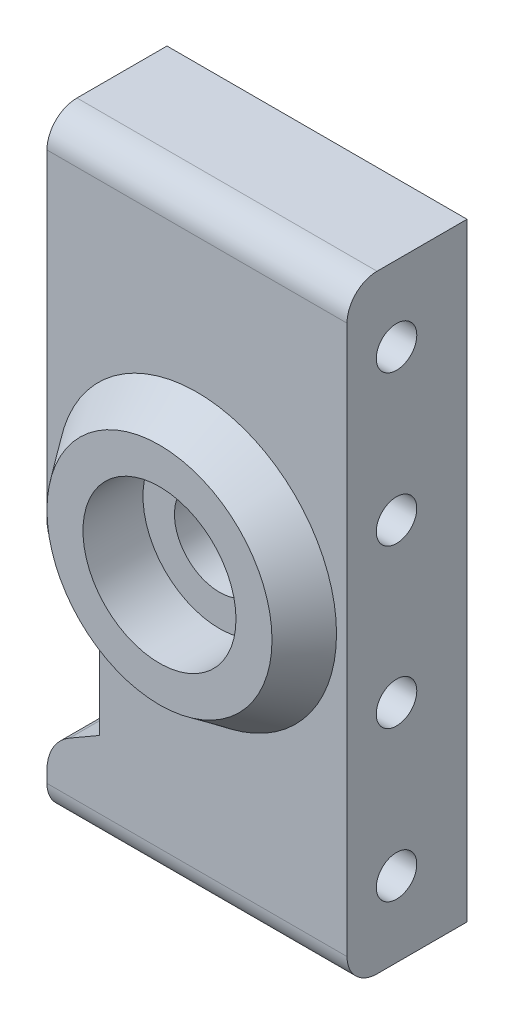
ISO-10303-21;
HEADER;
FILE_DESCRIPTION(('STEP AP214'),'2;1');
FILE_NAME('part.step','',(''),(''),'','','');
FILE_SCHEMA(('AUTOMOTIVE_DESIGN { 1 0 10303 214 1 1 1 1 }'));
ENDSEC;
DATA;
#1=APPLICATION_CONTEXT('core data for automotive mechanical design processes');
#2=APPLICATION_PROTOCOL_DEFINITION('international standard','automotive_design',2000,#1);
#3=PRODUCT_CONTEXT('',#1,'mechanical');
#4=PRODUCT('Part','Part','',(#3));
#5=PRODUCT_RELATED_PRODUCT_CATEGORY('part','',(#4));
#6=PRODUCT_DEFINITION_FORMATION('','',#4);
#7=PRODUCT_DEFINITION_CONTEXT('part definition',#1,'design');
#8=PRODUCT_DEFINITION('design','',#6,#7);
#9=PRODUCT_DEFINITION_SHAPE('','',#8);
#10=(LENGTH_UNIT() NAMED_UNIT(*) SI_UNIT(.MILLI.,.METRE.));
#11=(NAMED_UNIT(*) PLANE_ANGLE_UNIT() SI_UNIT($,.RADIAN.));
#12=(NAMED_UNIT(*) SI_UNIT($,.STERADIAN.) SOLID_ANGLE_UNIT());
#13=UNCERTAINTY_MEASURE_WITH_UNIT(LENGTH_MEASURE(1.E-05),#10,'distance_accuracy_value','');
#14=(GEOMETRIC_REPRESENTATION_CONTEXT(3) GLOBAL_UNCERTAINTY_ASSIGNED_CONTEXT((#13)) GLOBAL_UNIT_ASSIGNED_CONTEXT((#10,
#11,#12)) REPRESENTATION_CONTEXT('',''));
#15=CARTESIAN_POINT('',(0.,0.,0.));
#16=DIRECTION('',(0.,0.,1.));
#17=DIRECTION('',(1.,0.,0.));
#18=AXIS2_PLACEMENT_3D('',#15,#16,#17);
#19=CARTESIAN_POINT('',(-10.,20.28038,-8.));
#20=DIRECTION('',(-1.,0.,0.));
#21=DIRECTION('',(0.,-1.,0.));
#22=AXIS2_PLACEMENT_3D('',#19,#20,#21);
#23=PLANE('',#22);
#24=DIRECTION('',(0.,-1.,0.));
#25=VECTOR('',#24,1.);
#26=CARTESIAN_POINT('',(-10.,20.28038,-8.));
#27=LINE('',#26,#25);
#28=CARTESIAN_POINT('',(-10.,20.28038,-8.));
#29=VERTEX_POINT('',#28);
#30=CARTESIAN_POINT('',(-10.,-3.01239325026743,-8.));
#31=VERTEX_POINT('',#30);
#32=EDGE_CURVE('E197',#29,#31,#27,.T.);
#33=ORIENTED_EDGE('',*,*,#32,.T.);
#34=DIRECTION('',(0.,0.,1.));
#35=VECTOR('',#34,1.);
#36=CARTESIAN_POINT('',(-10.,-3.01239325026743,-8.));
#37=LINE('',#36,#35);
#38=CARTESIAN_POINT('',(-10.,-3.01239325026743,0.));
#39=VERTEX_POINT('',#38);
#40=EDGE_CURVE('E41',#31,#39,#37,.T.);
#41=ORIENTED_EDGE('',*,*,#40,.T.);
#42=DIRECTION('',(0.,-1.,0.));
#43=VECTOR('',#42,1.);
#44=CARTESIAN_POINT('',(-10.,20.28038,0.));
#45=LINE('',#44,#43);
#46=CARTESIAN_POINT('',(-10.,18.28038,0.));
#47=VERTEX_POINT('',#46);
#48=EDGE_CURVE('E207',#47,#39,#45,.T.);
#49=ORIENTED_EDGE('',*,*,#48,.F.);
#50=CARTESIAN_POINT('',(-10.,18.28038,-2.));
#51=DIRECTION('',(-1.,0.,0.));
#52=DIRECTION('',(0.,-1.,0.));
#53=AXIS2_PLACEMENT_3D('',#50,#51,#52);
#54=CIRCLE('',#53,2.);
#55=CARTESIAN_POINT('',(-10.,20.28038,-2.));
#56=VERTEX_POINT('',#55);
#57=EDGE_CURVE('E234',#47,#56,#54,.T.);
#58=ORIENTED_EDGE('',*,*,#57,.T.);
#59=DIRECTION('',(0.,0.,1.));
#60=VECTOR('',#59,1.);
#61=CARTESIAN_POINT('',(-10.,20.28038,-8.));
#62=LINE('',#61,#60);
#63=EDGE_CURVE('E206',#29,#56,#62,.T.);
#64=ORIENTED_EDGE('',*,*,#63,.F.);
#65=EDGE_LOOP('',(#33,#41,#49,#58,#64));
#66=FACE_BOUND('',#65,.T.);
#67=ADVANCED_FACE('F33',(#66),#23,.T.);
#68=CARTESIAN_POINT('',(9.99999999999999,20.28038,-8.));
#69=DIRECTION('',(0.,1.,0.));
#70=DIRECTION('',(-1.,0.,0.));
#71=AXIS2_PLACEMENT_3D('',#68,#69,#70);
#72=PLANE('',#71);
#73=ORIENTED_EDGE('',*,*,#63,.T.);
#74=DIRECTION('',(-1.,0.,0.));
#75=VECTOR('',#74,1.);
#76=CARTESIAN_POINT('',(9.99999999999999,20.28038,-2.));
#77=LINE('',#76,#75);
#78=CARTESIAN_POINT('',(9.99999999999999,20.28038,-2.));
#79=VERTEX_POINT('',#78);
#80=EDGE_CURVE('E239',#56,#79,#77,.F.);
#81=ORIENTED_EDGE('',*,*,#80,.T.);
#82=DIRECTION('',(0.,0.,1.));
#83=VECTOR('',#82,1.);
#84=CARTESIAN_POINT('',(9.99999999999999,20.28038,-8.));
#85=LINE('',#84,#83);
#86=CARTESIAN_POINT('',(9.99999999999999,20.28038,-8.));
#87=VERTEX_POINT('',#86);
#88=EDGE_CURVE('E211',#87,#79,#85,.T.);
#89=ORIENTED_EDGE('',*,*,#88,.F.);
#90=DIRECTION('',(-1.,0.,0.));
#91=VECTOR('',#90,1.);
#92=CARTESIAN_POINT('',(9.99999999999999,20.28038,-8.));
#93=LINE('',#92,#91);
#94=EDGE_CURVE('E192',#87,#29,#93,.T.);
#95=ORIENTED_EDGE('',*,*,#94,.T.);
#96=EDGE_LOOP('',(#73,#81,#89,#95));
#97=FACE_BOUND('',#96,.T.);
#98=ADVANCED_FACE('F270',(#97),#72,.T.);
#99=CARTESIAN_POINT('',(9.99999999999999,-20.28038,-8.));
#100=DIRECTION('',(1.,0.,0.));
#101=DIRECTION('',(0.,0.,-1.));
#102=AXIS2_PLACEMENT_3D('',#99,#100,#101);
#103=PLANE('',#102);
#104=CARTESIAN_POINT('',(9.99999999999999,-15.26519,-3.3));
#105=DIRECTION('',(1.,0.,0.));
#106=DIRECTION('',(0.,0.,1.));
#107=AXIS2_PLACEMENT_3D('',#104,#105,#106);
#108=CIRCLE('',#107,1.35);
#109=CARTESIAN_POINT('',(9.99999999999999,-15.26519,-1.95));
#110=VERTEX_POINT('',#109);
#111=EDGE_CURVE('E172',#110,#110,#108,.T.);
#112=ORIENTED_EDGE('',*,*,#111,.F.);
#113=EDGE_LOOP('',(#112));
#114=FACE_BOUND('',#113,.T.);
#115=CARTESIAN_POINT('',(9.99999999999999,5.26519,-3.3));
#116=DIRECTION('',(1.,0.,0.));
#117=DIRECTION('',(0.,0.,1.));
#118=AXIS2_PLACEMENT_3D('',#115,#116,#117);
#119=CIRCLE('',#118,1.35);
#120=CARTESIAN_POINT('',(9.99999999999999,5.26519,-1.95));
#121=VERTEX_POINT('',#120);
#122=EDGE_CURVE('E167',#121,#121,#119,.T.);
#123=ORIENTED_EDGE('',*,*,#122,.F.);
#124=EDGE_LOOP('',(#123));
#125=FACE_BOUND('',#124,.T.);
#126=CARTESIAN_POINT('',(9.99999999999999,15.26519,-3.3));
#127=DIRECTION('',(1.,0.,0.));
#128=DIRECTION('',(0.,0.,-1.));
#129=AXIS2_PLACEMENT_3D('',#126,#127,#128);
#130=CIRCLE('',#129,1.35);
#131=CARTESIAN_POINT('',(9.99999999999999,15.26519,-4.65));
#132=VERTEX_POINT('',#131);
#133=EDGE_CURVE('E179',#132,#132,#130,.T.);
#134=ORIENTED_EDGE('',*,*,#133,.F.);
#135=EDGE_LOOP('',(#134));
#136=FACE_BOUND('',#135,.T.);
#137=CARTESIAN_POINT('',(9.99999999999999,-5.26519,-3.3));
#138=DIRECTION('',(1.,0.,0.));
#139=DIRECTION('',(0.,0.,-1.));
#140=AXIS2_PLACEMENT_3D('',#137,#138,#139);
#141=CIRCLE('',#140,1.35);
#142=CARTESIAN_POINT('',(9.99999999999999,-5.26519,-4.65));
#143=VERTEX_POINT('',#142);
#144=EDGE_CURVE('E184',#143,#143,#141,.T.);
#145=ORIENTED_EDGE('',*,*,#144,.F.);
#146=EDGE_LOOP('',(#145));
#147=FACE_BOUND('',#146,.T.);
#148=DIRECTION('',(0.,1.,0.));
#149=VECTOR('',#148,1.);
#150=CARTESIAN_POINT('',(9.99999999999999,-20.28038,0.));
#151=LINE('',#150,#149);
#152=CARTESIAN_POINT('',(9.99999999999999,-18.28038,0.));
#153=VERTEX_POINT('',#152);
#154=CARTESIAN_POINT('',(9.99999999999999,18.28038,0.));
#155=VERTEX_POINT('',#154);
#156=EDGE_CURVE('E196',#153,#155,#151,.T.);
#157=ORIENTED_EDGE('',*,*,#156,.F.);
#158=CARTESIAN_POINT('',(9.99999999999999,-18.28038,-2.));
#159=DIRECTION('',(1.,0.,0.));
#160=DIRECTION('',(0.,0.,-1.));
#161=AXIS2_PLACEMENT_3D('',#158,#159,#160);
#162=CIRCLE('',#161,2.);
#163=CARTESIAN_POINT('',(9.99999999999999,-20.28038,-2.));
#164=VERTEX_POINT('',#163);
#165=EDGE_CURVE('E230',#153,#164,#162,.T.);
#166=ORIENTED_EDGE('',*,*,#165,.T.);
#167=DIRECTION('',(0.,0.,1.));
#168=VECTOR('',#167,1.);
#169=CARTESIAN_POINT('',(9.99999999999999,-20.28038,-8.));
#170=LINE('',#169,#168);
#171=CARTESIAN_POINT('',(9.99999999999999,-20.28038,-8.));
#172=VERTEX_POINT('',#171);
#173=EDGE_CURVE('E215',#172,#164,#170,.T.);
#174=ORIENTED_EDGE('',*,*,#173,.F.);
#175=DIRECTION('',(0.,1.,0.));
#176=VECTOR('',#175,1.);
#177=CARTESIAN_POINT('',(9.99999999999999,-20.28038,-8.));
#178=LINE('',#177,#176);
#179=EDGE_CURVE('E203',#172,#87,#178,.T.);
#180=ORIENTED_EDGE('',*,*,#179,.T.);
#181=ORIENTED_EDGE('',*,*,#88,.T.);
#182=CARTESIAN_POINT('',(9.99999999999999,18.28038,-2.));
#183=DIRECTION('',(1.,0.,0.));
#184=DIRECTION('',(0.,0.,-1.));
#185=AXIS2_PLACEMENT_3D('',#182,#183,#184);
#186=CIRCLE('',#185,2.);
#187=EDGE_CURVE('E228',#79,#155,#186,.T.);
#188=ORIENTED_EDGE('',*,*,#187,.T.);
#189=EDGE_LOOP('',(#157,#166,#174,#180,#181,#188));
#190=FACE_BOUND('',#189,.T.);
#191=ADVANCED_FACE('F275',(#114,#125,#136,#147,#190),#103,.T.);
#192=CARTESIAN_POINT('',(-10.,-20.28038,-8.));
#193=DIRECTION('',(0.,-1.,0.));
#194=DIRECTION('',(0.,0.,-1.));
#195=AXIS2_PLACEMENT_3D('',#192,#193,#194);
#196=PLANE('',#195);
#197=ORIENTED_EDGE('',*,*,#173,.T.);
#198=DIRECTION('',(1.,0.,0.));
#199=VECTOR('',#198,1.);
#200=CARTESIAN_POINT('',(-10.,-20.28038,-2.));
#201=LINE('',#200,#199);
#202=CARTESIAN_POINT('',(-10.,-20.28038,-2.));
#203=VERTEX_POINT('',#202);
#204=EDGE_CURVE('E232',#164,#203,#201,.F.);
#205=ORIENTED_EDGE('',*,*,#204,.T.);
#206=DIRECTION('',(0.,0.,1.));
#207=VECTOR('',#206,1.);
#208=CARTESIAN_POINT('',(-10.,-20.28038,-8.));
#209=LINE('',#208,#207);
#210=CARTESIAN_POINT('',(-10.,-20.28038,-8.));
#211=VERTEX_POINT('',#210);
#212=EDGE_CURVE('E218',#211,#203,#209,.T.);
#213=ORIENTED_EDGE('',*,*,#212,.F.);
#214=DIRECTION('',(1.,0.,0.));
#215=VECTOR('',#214,1.);
#216=CARTESIAN_POINT('',(-10.,-20.28038,-8.));
#217=LINE('',#216,#215);
#218=EDGE_CURVE('E200',#211,#172,#217,.T.);
#219=ORIENTED_EDGE('',*,*,#218,.T.);
#220=EDGE_LOOP('',(#197,#205,#213,#219));
#221=FACE_BOUND('',#220,.T.);
#222=ADVANCED_FACE('F279',(#221),#196,.T.);
#223=CARTESIAN_POINT('',(-10.,-17.5179467497326,0.));
#224=VERTEX_POINT('',#223);
#225=CARTESIAN_POINT('',(-10.,-18.28038,0.));
#226=VERTEX_POINT('',#225);
#227=EDGE_CURVE('E171',#224,#226,#45,.T.);
#228=ORIENTED_EDGE('',*,*,#227,.F.);
#229=DIRECTION('',(0.,0.,-1.));
#230=VECTOR('',#229,1.);
#231=CARTESIAN_POINT('',(-10.,-17.5179467497326,-8.));
#232=LINE('',#231,#230);
#233=CARTESIAN_POINT('',(-10.,-17.5179467497326,-8.));
#234=VERTEX_POINT('',#233);
#235=EDGE_CURVE('E131',#224,#234,#232,.T.);
#236=ORIENTED_EDGE('',*,*,#235,.T.);
#237=EDGE_CURVE('E195',#234,#211,#27,.T.);
#238=ORIENTED_EDGE('',*,*,#237,.T.);
#239=ORIENTED_EDGE('',*,*,#212,.T.);
#240=CARTESIAN_POINT('',(-10.,-18.28038,-2.));
#241=DIRECTION('',(-1.,0.,0.));
#242=DIRECTION('',(0.,-1.,0.));
#243=AXIS2_PLACEMENT_3D('',#240,#241,#242);
#244=CIRCLE('',#243,2.);
#245=EDGE_CURVE('E236',#203,#226,#244,.T.);
#246=ORIENTED_EDGE('',*,*,#245,.T.);
#247=EDGE_LOOP('',(#228,#236,#238,#239,#246));
#248=FACE_BOUND('',#247,.T.);
#249=ADVANCED_FACE('F282',(#248),#23,.T.);
#250=CARTESIAN_POINT('',(0.,0.,-8.));
#251=DIRECTION('',(0.,0.,1.));
#252=DIRECTION('',(1.,0.,0.));
#253=AXIS2_PLACEMENT_3D('',#250,#251,#252);
#254=PLANE('',#253);
#255=CARTESIAN_POINT('',(0.,0.,-8.));
#256=DIRECTION('',(0.,0.,1.));
#257=DIRECTION('',(1.,0.,0.));
#258=AXIS2_PLACEMENT_3D('',#255,#256,#257);
#259=CIRCLE('',#258,3.);
#260=CARTESIAN_POINT('',(3.,0.,-8.));
#261=VERTEX_POINT('',#260);
#262=EDGE_CURVE('E155',#261,#261,#259,.F.);
#263=ORIENTED_EDGE('',*,*,#262,.F.);
#264=EDGE_LOOP('',(#263));
#265=FACE_BOUND('',#264,.T.);
#266=ORIENTED_EDGE('',*,*,#237,.F.);
#267=CARTESIAN_POINT('',(-7.,-17.5179467497326,-8.));
#268=DIRECTION('',(0.,0.,1.));
#269=DIRECTION('',(1.,0.,0.));
#270=AXIS2_PLACEMENT_3D('',#267,#268,#269);
#271=CIRCLE('',#270,3.);
#272=CARTESIAN_POINT('',(-8.5,-14.9198705383793,-8.));
#273=VERTEX_POINT('',#272);
#274=EDGE_CURVE('E127',#234,#273,#271,.F.);
#275=ORIENTED_EDGE('',*,*,#274,.T.);
#276=DIRECTION('',(0.86602540378444,0.499999999999998,0.));
#277=VECTOR('',#276,1.);
#278=CARTESIAN_POINT('',(-6.49999999999999,-13.76517,-8.));
#279=LINE('',#278,#277);
#280=CARTESIAN_POINT('',(-6.5,-13.76517,-8.));
#281=VERTEX_POINT('',#280);
#282=EDGE_CURVE('E121',#273,#281,#279,.T.);
#283=ORIENTED_EDGE('',*,*,#282,.T.);
#284=DIRECTION('',(0.,-1.,0.));
#285=VECTOR('',#284,1.);
#286=CARTESIAN_POINT('',(-6.5,-13.76517,-8.));
#287=LINE('',#286,#285);
#288=CARTESIAN_POINT('',(-6.5,-6.76517,-8.));
#289=VERTEX_POINT('',#288);
#290=EDGE_CURVE('E126',#289,#281,#287,.T.);
#291=ORIENTED_EDGE('',*,*,#290,.F.);
#292=DIRECTION('',(-0.86602540378444,0.499999999999998,0.));
#293=VECTOR('',#292,1.);
#294=CARTESIAN_POINT('',(-6.49999999999997,-6.76517,-8.));
#295=LINE('',#294,#293);
#296=CARTESIAN_POINT('',(-8.49999999999999,-5.61046946162074,-8.));
#297=VERTEX_POINT('',#296);
#298=EDGE_CURVE('E132',#289,#297,#295,.T.);
#299=ORIENTED_EDGE('',*,*,#298,.T.);
#300=CARTESIAN_POINT('',(-7.,-3.01239325026743,-8.));
#301=DIRECTION('',(0.,0.,1.));
#302=DIRECTION('',(1.,0.,0.));
#303=AXIS2_PLACEMENT_3D('',#300,#301,#302);
#304=CIRCLE('',#303,3.);
#305=EDGE_CURVE('E250',#297,#31,#304,.F.);
#306=ORIENTED_EDGE('',*,*,#305,.T.);
#307=ORIENTED_EDGE('',*,*,#32,.F.);
#308=ORIENTED_EDGE('',*,*,#94,.F.);
#309=ORIENTED_EDGE('',*,*,#179,.F.);
#310=ORIENTED_EDGE('',*,*,#218,.F.);
#311=EDGE_LOOP('',(#266,#275,#283,#291,#299,#306,#307,#308,#309,#310));
#312=FACE_BOUND('',#311,.T.);
#313=ADVANCED_FACE('F124',(#265,#312),#254,.F.);
#314=CARTESIAN_POINT('',(0.,0.,0.));
#315=DIRECTION('',(0.,0.,1.));
#316=DIRECTION('',(1.,0.,0.));
#317=AXIS2_PLACEMENT_3D('',#314,#315,#316);
#318=PLANE('',#317);
#319=DIRECTION('',(-0.86602540378444,-0.499999999999998,0.));
#320=VECTOR('',#319,1.);
#321=CARTESIAN_POINT('',(4.33549345370572,-7.50929493770061,0.));
#322=LINE('',#321,#320);
#323=CARTESIAN_POINT('',(-6.5,-13.76517,0.));
#324=VERTEX_POINT('',#323);
#325=CARTESIAN_POINT('',(-8.5,-14.9198705383793,0.));
#326=VERTEX_POINT('',#325);
#327=EDGE_CURVE('E146',#324,#326,#322,.T.);
#328=ORIENTED_EDGE('',*,*,#327,.T.);
#329=CARTESIAN_POINT('',(-7.,-17.5179467497326,0.));
#330=DIRECTION('',(0.,0.,1.));
#331=DIRECTION('',(1.,0.,0.));
#332=AXIS2_PLACEMENT_3D('',#329,#330,#331);
#333=CIRCLE('',#332,3.);
#334=EDGE_CURVE('E256',#326,#224,#333,.T.);
#335=ORIENTED_EDGE('',*,*,#334,.T.);
#336=ORIENTED_EDGE('',*,*,#227,.T.);
#337=DIRECTION('',(1.,0.,0.));
#338=VECTOR('',#337,1.);
#339=CARTESIAN_POINT('',(0.,-18.28038,0.));
#340=LINE('',#339,#338);
#341=EDGE_CURVE('E225',#226,#153,#340,.T.);
#342=ORIENTED_EDGE('',*,*,#341,.T.);
#343=ORIENTED_EDGE('',*,*,#156,.T.);
#344=DIRECTION('',(-1.,0.,0.));
#345=VECTOR('',#344,1.);
#346=CARTESIAN_POINT('',(0.,18.28038,0.));
#347=LINE('',#346,#345);
#348=EDGE_CURVE('E214',#155,#47,#347,.T.);
#349=ORIENTED_EDGE('',*,*,#348,.T.);
#350=ORIENTED_EDGE('',*,*,#48,.T.);
#351=CARTESIAN_POINT('',(-7.,-3.01239325026743,0.));
#352=DIRECTION('',(0.,0.,1.));
#353=DIRECTION('',(1.,0.,0.));
#354=AXIS2_PLACEMENT_3D('',#351,#352,#353);
#355=CIRCLE('',#354,3.);
#356=CARTESIAN_POINT('',(-8.5,-5.61046946162074,0.));
#357=VERTEX_POINT('',#356);
#358=EDGE_CURVE('E48',#39,#357,#355,.T.);
#359=ORIENTED_EDGE('',*,*,#358,.T.);
#360=DIRECTION('',(0.86602540378444,-0.499999999999998,0.));
#361=VECTOR('',#360,1.);
#362=CARTESIAN_POINT('',(-4.55440454046015,-7.88846006229942,0.));
#363=LINE('',#362,#361);
#364=CARTESIAN_POINT('',(-6.5,-6.76517,0.));
#365=VERTEX_POINT('',#364);
#366=EDGE_CURVE('E244',#357,#365,#363,.T.);
#367=ORIENTED_EDGE('',*,*,#366,.T.);
#368=DIRECTION('',(0.,1.,0.));
#369=VECTOR('',#368,1.);
#370=CARTESIAN_POINT('',(-6.5,-6.76517,0.));
#371=LINE('',#370,#369);
#372=EDGE_CURVE('E147',#324,#365,#371,.T.);
#373=ORIENTED_EDGE('',*,*,#372,.F.);
#374=EDGE_LOOP('',(#328,#335,#336,#342,#343,#349,#350,#359,#367,#373));
#375=FACE_BOUND('',#374,.T.);
#376=CARTESIAN_POINT('',(0.,0.,0.));
#377=DIRECTION('',(0.,0.,1.));
#378=DIRECTION('',(1.,0.,0.));
#379=AXIS2_PLACEMENT_3D('',#376,#377,#378);
#380=CIRCLE('',#379,9.3);
#381=CARTESIAN_POINT('',(9.29999999999999,0.,0.));
#382=VERTEX_POINT('',#381);
#383=EDGE_CURVE('E241',#382,#382,#380,.F.);
#384=ORIENTED_EDGE('',*,*,#383,.T.);
#385=EDGE_LOOP('',(#384));
#386=FACE_BOUND('',#385,.T.);
#387=ADVANCED_FACE('F261',(#375,#386),#318,.T.);
#388=CARTESIAN_POINT('',(0.,-5.26519,-3.3));
#389=DIRECTION('',(1.,0.,0.));
#390=DIRECTION('',(0.,0.,-1.));
#391=AXIS2_PLACEMENT_3D('',#388,#389,#390);
#392=CYLINDRICAL_SURFACE('',#391,1.35);
#393=CARTESIAN_POINT('',(0.,-5.26519,-3.3));
#394=DIRECTION('',(1.,0.,0.));
#395=DIRECTION('',(0.,0.,-1.));
#396=AXIS2_PLACEMENT_3D('',#393,#394,#395);
#397=CIRCLE('',#396,1.35);
#398=CARTESIAN_POINT('',(0.,-5.26519,-4.65));
#399=VERTEX_POINT('',#398);
#400=EDGE_CURVE('E175',#399,#399,#397,.T.);
#401=ORIENTED_EDGE('',*,*,#400,.F.);
#402=EDGE_LOOP('',(#401));
#403=FACE_BOUND('',#402,.T.);
#404=ORIENTED_EDGE('',*,*,#144,.T.);
#405=EDGE_LOOP('',(#404));
#406=FACE_BOUND('',#405,.T.);
#407=ADVANCED_FACE('F316',(#403,#406),#392,.F.);
#408=CARTESIAN_POINT('',(0.,-5.26519,-3.3));
#409=DIRECTION('',(1.,0.,0.));
#410=DIRECTION('',(0.,0.,-1.));
#411=AXIS2_PLACEMENT_3D('',#408,#409,#410);
#412=PLANE('',#411);
#413=ORIENTED_EDGE('',*,*,#400,.T.);
#414=EDGE_LOOP('',(#413));
#415=FACE_BOUND('',#414,.T.);
#416=ADVANCED_FACE('F322',(#415),#412,.T.);
#417=CARTESIAN_POINT('',(0.,15.26519,-3.3));
#418=DIRECTION('',(1.,0.,0.));
#419=DIRECTION('',(0.,0.,-1.));
#420=AXIS2_PLACEMENT_3D('',#417,#418,#419);
#421=CYLINDRICAL_SURFACE('',#420,1.35);
#422=CARTESIAN_POINT('',(0.,15.26519,-3.3));
#423=DIRECTION('',(1.,0.,0.));
#424=DIRECTION('',(0.,0.,-1.));
#425=AXIS2_PLACEMENT_3D('',#422,#423,#424);
#426=CIRCLE('',#425,1.35);
#427=CARTESIAN_POINT('',(0.,15.26519,-4.65));
#428=VERTEX_POINT('',#427);
#429=EDGE_CURVE('E187',#428,#428,#426,.T.);
#430=ORIENTED_EDGE('',*,*,#429,.F.);
#431=EDGE_LOOP('',(#430));
#432=FACE_BOUND('',#431,.T.);
#433=ORIENTED_EDGE('',*,*,#133,.T.);
#434=EDGE_LOOP('',(#433));
#435=FACE_BOUND('',#434,.T.);
#436=ADVANCED_FACE('F318',(#432,#435),#421,.F.);
#437=CARTESIAN_POINT('',(0.,15.26519,-3.3));
#438=DIRECTION('',(1.,0.,0.));
#439=DIRECTION('',(0.,0.,-1.));
#440=AXIS2_PLACEMENT_3D('',#437,#438,#439);
#441=PLANE('',#440);
#442=ORIENTED_EDGE('',*,*,#429,.T.);
#443=EDGE_LOOP('',(#442));
#444=FACE_BOUND('',#443,.T.);
#445=ADVANCED_FACE('F321',(#444),#441,.T.);
#446=CARTESIAN_POINT('',(0.,5.26519,-3.3));
#447=DIRECTION('',(1.,0.,0.));
#448=DIRECTION('',(0.,0.,-1.));
#449=AXIS2_PLACEMENT_3D('',#446,#447,#448);
#450=CYLINDRICAL_SURFACE('',#449,1.35);
#451=CARTESIAN_POINT('',(0.,5.26519,-3.3));
#452=DIRECTION('',(1.,0.,0.));
#453=DIRECTION('',(0.,0.,1.));
#454=AXIS2_PLACEMENT_3D('',#451,#452,#453);
#455=CIRCLE('',#454,1.35);
#456=CARTESIAN_POINT('',(0.,5.26519,-1.95));
#457=VERTEX_POINT('',#456);
#458=EDGE_CURVE('E176',#457,#457,#455,.T.);
#459=ORIENTED_EDGE('',*,*,#458,.F.);
#460=EDGE_LOOP('',(#459));
#461=FACE_BOUND('',#460,.T.);
#462=ORIENTED_EDGE('',*,*,#122,.T.);
#463=EDGE_LOOP('',(#462));
#464=FACE_BOUND('',#463,.T.);
#465=ADVANCED_FACE('F326',(#461,#464),#450,.F.);
#466=CARTESIAN_POINT('',(0.,5.26519,-3.3));
#467=DIRECTION('',(-1.,0.,0.));
#468=DIRECTION('',(0.,0.,1.));
#469=AXIS2_PLACEMENT_3D('',#466,#467,#468);
#470=PLANE('',#469);
#471=ORIENTED_EDGE('',*,*,#458,.T.);
#472=EDGE_LOOP('',(#471));
#473=FACE_BOUND('',#472,.T.);
#474=ADVANCED_FACE('F336',(#473),#470,.F.);
#475=CARTESIAN_POINT('',(0.,-15.26519,-3.3));
#476=DIRECTION('',(1.,0.,0.));
#477=DIRECTION('',(0.,0.,-1.));
#478=AXIS2_PLACEMENT_3D('',#475,#476,#477);
#479=CYLINDRICAL_SURFACE('',#478,1.35);
#480=CARTESIAN_POINT('',(0.,-15.26519,-3.3));
#481=DIRECTION('',(1.,0.,0.));
#482=DIRECTION('',(0.,0.,1.));
#483=AXIS2_PLACEMENT_3D('',#480,#481,#482);
#484=CIRCLE('',#483,1.35);
#485=CARTESIAN_POINT('',(0.,-15.26519,-1.95));
#486=VERTEX_POINT('',#485);
#487=EDGE_CURVE('E168',#486,#486,#484,.T.);
#488=ORIENTED_EDGE('',*,*,#487,.F.);
#489=EDGE_LOOP('',(#488));
#490=FACE_BOUND('',#489,.T.);
#491=ORIENTED_EDGE('',*,*,#111,.T.);
#492=EDGE_LOOP('',(#491));
#493=FACE_BOUND('',#492,.T.);
#494=ADVANCED_FACE('F340',(#490,#493),#479,.F.);
#495=CARTESIAN_POINT('',(0.,-15.26519,-3.3));
#496=DIRECTION('',(-1.,0.,0.));
#497=DIRECTION('',(0.,0.,1.));
#498=AXIS2_PLACEMENT_3D('',#495,#496,#497);
#499=PLANE('',#498);
#500=ORIENTED_EDGE('',*,*,#487,.T.);
#501=EDGE_LOOP('',(#500));
#502=FACE_BOUND('',#501,.T.);
#503=ADVANCED_FACE('F344',(#502),#499,.F.);
#504=CARTESIAN_POINT('',(0.,0.,2.5));
#505=DIRECTION('',(0.,0.,1.));
#506=DIRECTION('',(1.,0.,0.));
#507=AXIS2_PLACEMENT_3D('',#504,#505,#506);
#508=PLANE('',#507);
#509=CARTESIAN_POINT('',(0.,0.,2.5));
#510=DIRECTION('',(0.,0.,1.));
#511=DIRECTION('',(1.,0.,0.));
#512=AXIS2_PLACEMENT_3D('',#509,#510,#511);
#513=CIRCLE('',#512,5.1);
#514=CARTESIAN_POINT('',(5.1,0.,2.5));
#515=VERTEX_POINT('',#514);
#516=EDGE_CURVE('E158',#515,#515,#513,.T.);
#517=ORIENTED_EDGE('',*,*,#516,.F.);
#518=EDGE_LOOP('',(#517));
#519=FACE_BOUND('',#518,.T.);
#520=CARTESIAN_POINT('',(0.,0.,2.5));
#521=DIRECTION('',(0.,0.,1.));
#522=DIRECTION('',(1.,0.,0.));
#523=AXIS2_PLACEMENT_3D('',#520,#521,#522);
#524=CIRCLE('',#523,7.5);
#525=CARTESIAN_POINT('',(7.5,0.,2.5));
#526=VERTEX_POINT('',#525);
#527=EDGE_CURVE('E162',#526,#526,#524,.T.);
#528=ORIENTED_EDGE('',*,*,#527,.T.);
#529=EDGE_LOOP('',(#528));
#530=FACE_BOUND('',#529,.T.);
#531=ADVANCED_FACE('F348',(#519,#530),#508,.T.);
#532=CARTESIAN_POINT('',(0.,0.,-1.5));
#533=DIRECTION('',(0.,0.,1.));
#534=DIRECTION('',(1.,0.,0.));
#535=AXIS2_PLACEMENT_3D('',#532,#533,#534);
#536=CYLINDRICAL_SURFACE('',#535,5.1);
#537=CARTESIAN_POINT('',(0.,0.,-1.5));
#538=DIRECTION('',(0.,0.,1.));
#539=DIRECTION('',(1.,0.,0.));
#540=AXIS2_PLACEMENT_3D('',#537,#538,#539);
#541=CIRCLE('',#540,5.1);
#542=CARTESIAN_POINT('',(5.1,0.,-1.5));
#543=VERTEX_POINT('',#542);
#544=EDGE_CURVE('E159',#543,#543,#541,.T.);
#545=ORIENTED_EDGE('',*,*,#544,.F.);
#546=EDGE_LOOP('',(#545));
#547=FACE_BOUND('',#546,.T.);
#548=ORIENTED_EDGE('',*,*,#516,.T.);
#549=EDGE_LOOP('',(#548));
#550=FACE_BOUND('',#549,.T.);
#551=ADVANCED_FACE('F352',(#547,#550),#536,.F.);
#552=CARTESIAN_POINT('',(0.,0.,-1.5));
#553=DIRECTION('',(0.,0.,1.));
#554=DIRECTION('',(1.,0.,0.));
#555=AXIS2_PLACEMENT_3D('',#552,#553,#554);
#556=PLANE('',#555);
#557=CARTESIAN_POINT('',(0.,0.,-1.5));
#558=DIRECTION('',(0.,0.,1.));
#559=DIRECTION('',(1.,0.,0.));
#560=AXIS2_PLACEMENT_3D('',#557,#558,#559);
#561=CIRCLE('',#560,3.);
#562=CARTESIAN_POINT('',(3.,0.,-1.5));
#563=VERTEX_POINT('',#562);
#564=EDGE_CURVE('E152',#563,#563,#561,.T.);
#565=ORIENTED_EDGE('',*,*,#564,.F.);
#566=EDGE_LOOP('',(#565));
#567=FACE_BOUND('',#566,.T.);
#568=ORIENTED_EDGE('',*,*,#544,.T.);
#569=EDGE_LOOP('',(#568));
#570=FACE_BOUND('',#569,.T.);
#571=ADVANCED_FACE('F356',(#567,#570),#556,.T.);
#572=CARTESIAN_POINT('',(0.,0.,-16.4852813742386));
#573=DIRECTION('',(0.,0.,1.));
#574=DIRECTION('',(1.,0.,0.));
#575=AXIS2_PLACEMENT_3D('',#572,#573,#574);
#576=CYLINDRICAL_SURFACE('',#575,3.);
#577=CARTESIAN_POINT('',(3.,0.,-8.));
#578=CARTESIAN_POINT('',(3.,0.,-7.93229166666667));
#579=CARTESIAN_POINT('',(3.,0.,-7.86458333333333));
#580=CARTESIAN_POINT('',(3.,0.,-7.72916666666667));
#581=CARTESIAN_POINT('',(3.,0.,-7.66145833333333));
#582=CARTESIAN_POINT('',(3.,0.,-7.52604166666667));
#583=CARTESIAN_POINT('',(3.,0.,-7.45833333333333));
#584=CARTESIAN_POINT('',(3.,0.,-7.32291666666667));
#585=CARTESIAN_POINT('',(3.,0.,-7.25520833333333));
#586=CARTESIAN_POINT('',(3.,0.,-7.11979166666667));
#587=CARTESIAN_POINT('',(3.,0.,-7.05208333333333));
#588=CARTESIAN_POINT('',(3.,0.,-6.91666666666667));
#589=CARTESIAN_POINT('',(3.,0.,-6.84895833333333));
#590=CARTESIAN_POINT('',(3.,0.,-6.71354166666667));
#591=CARTESIAN_POINT('',(3.,0.,-6.64583333333333));
#592=CARTESIAN_POINT('',(3.,0.,-6.51041666666667));
#593=CARTESIAN_POINT('',(3.,0.,-6.44270833333333));
#594=CARTESIAN_POINT('',(3.,0.,-6.30729166666667));
#595=CARTESIAN_POINT('',(3.,0.,-6.23958333333333));
#596=CARTESIAN_POINT('',(3.,0.,-6.10416666666667));
#597=CARTESIAN_POINT('',(3.,0.,-6.03645833333333));
#598=CARTESIAN_POINT('',(3.,0.,-5.90104166666667));
#599=CARTESIAN_POINT('',(3.,0.,-5.83333333333333));
#600=CARTESIAN_POINT('',(3.,0.,-5.69791666666667));
#601=CARTESIAN_POINT('',(3.,0.,-5.63020833333333));
#602=CARTESIAN_POINT('',(3.,0.,-5.49479166666667));
#603=CARTESIAN_POINT('',(3.,0.,-5.42708333333333));
#604=CARTESIAN_POINT('',(3.,0.,-5.29166666666667));
#605=CARTESIAN_POINT('',(3.,0.,-5.22395833333333));
#606=CARTESIAN_POINT('',(3.,0.,-5.08854166666667));
#607=CARTESIAN_POINT('',(3.,0.,-5.02083333333333));
#608=CARTESIAN_POINT('',(3.,0.,-4.88541666666667));
#609=CARTESIAN_POINT('',(3.,0.,-4.81770833333333));
#610=CARTESIAN_POINT('',(3.,0.,-4.68229166666667));
#611=CARTESIAN_POINT('',(3.,0.,-4.61458333333333));
#612=CARTESIAN_POINT('',(3.,0.,-4.47916666666667));
#613=CARTESIAN_POINT('',(3.,0.,-4.41145833333333));
#614=CARTESIAN_POINT('',(3.,0.,-4.27604166666667));
#615=CARTESIAN_POINT('',(3.,0.,-4.20833333333333));
#616=CARTESIAN_POINT('',(3.,0.,-4.07291666666667));
#617=CARTESIAN_POINT('',(3.,0.,-4.00520833333333));
#618=CARTESIAN_POINT('',(3.,0.,-3.86979166666667));
#619=CARTESIAN_POINT('',(3.,0.,-3.80208333333333));
#620=CARTESIAN_POINT('',(3.,0.,-3.66666666666667));
#621=CARTESIAN_POINT('',(3.,0.,-3.59895833333333));
#622=CARTESIAN_POINT('',(3.,0.,-3.46354166666667));
#623=CARTESIAN_POINT('',(3.,0.,-3.39583333333333));
#624=CARTESIAN_POINT('',(3.,0.,-3.26041666666667));
#625=CARTESIAN_POINT('',(3.,0.,-3.19270833333333));
#626=CARTESIAN_POINT('',(3.,0.,-3.05729166666667));
#627=CARTESIAN_POINT('',(3.,0.,-2.98958333333333));
#628=CARTESIAN_POINT('',(3.,0.,-2.85416666666667));
#629=CARTESIAN_POINT('',(3.,0.,-2.78645833333333));
#630=CARTESIAN_POINT('',(3.,0.,-2.65104166666667));
#631=CARTESIAN_POINT('',(3.,0.,-2.58333333333333));
#632=CARTESIAN_POINT('',(3.,0.,-2.44791666666667));
#633=CARTESIAN_POINT('',(3.,0.,-2.38020833333333));
#634=CARTESIAN_POINT('',(3.,0.,-2.24479166666667));
#635=CARTESIAN_POINT('',(3.,0.,-2.17708333333333));
#636=CARTESIAN_POINT('',(3.,0.,-2.04166666666667));
#637=CARTESIAN_POINT('',(3.,0.,-1.97395833333333));
#638=CARTESIAN_POINT('',(3.,0.,-1.83854166666667));
#639=CARTESIAN_POINT('',(3.,0.,-1.77083333333333));
#640=CARTESIAN_POINT('',(3.,0.,-1.63541666666667));
#641=CARTESIAN_POINT('',(3.,0.,-1.56770833333333));
#642=CARTESIAN_POINT('',(3.,0.,-1.5));
#643=B_SPLINE_CURVE_WITH_KNOTS('',3,(#577,#578,#579,#580,#581,#582,#583,#584,#585,#586,#587,
#588,#589,#590,#591,#592,#593,#594,#595,#596,#597,#598,#599,#600,#601,#602,#603,#604,#605,#606,
#607,#608,#609,#610,#611,#612,#613,#614,#615,#616,#617,#618,#619,#620,#621,#622,#623,#624,#625,
#626,#627,#628,#629,#630,#631,#632,#633,#634,#635,#636,#637,#638,#639,#640,#641,#642),
.UNSPECIFIED.,.F.,.F.,(4,2,2,2,2,2,2,2,2,2,2,2,2,2,2,2,2,2,2,2,2,2,2,2,2,2,2,2,2,2,2,2,4),(0.,
0.203125,0.40625,0.609375000000001,0.812500000000001,1.015625,1.21875,1.421875,1.625,1.828125,
2.03125,2.234375,2.4375,2.640625,2.84375,3.046875,3.25,3.453125,3.65625,3.859375,4.0625,
4.265625,4.46875,4.671875,4.875,5.078125,5.28125,5.484375,5.6875,5.890625,6.09375,6.296875,6.5),.UNSPECIFIED.);
#644=EDGE_CURVE('BSEAM360',#261,#563,#643,.T.);
#645=ORIENTED_EDGE('',*,*,#262,.T.);
#646=ORIENTED_EDGE('',*,*,#564,.T.);
#647=ORIENTED_EDGE('',*,*,#644,.T.);
#648=ORIENTED_EDGE('',*,*,#644,.F.);
#649=EDGE_LOOP('',(#645,#647,#646,#648));
#650=FACE_BOUND('',#649,.T.);
#651=ADVANCED_FACE('F360',(#650),#576,.F.);
#652=CARTESIAN_POINT('',(0.,-18.28038,-2.));
#653=DIRECTION('',(1.,0.,0.));
#654=DIRECTION('',(0.,0.,-1.));
#655=AXIS2_PLACEMENT_3D('',#652,#653,#654);
#656=CYLINDRICAL_SURFACE('',#655,2.);
#657=ORIENTED_EDGE('',*,*,#245,.F.);
#658=ORIENTED_EDGE('',*,*,#204,.F.);
#659=ORIENTED_EDGE('',*,*,#165,.F.);
#660=ORIENTED_EDGE('',*,*,#341,.F.);
#661=EDGE_LOOP('',(#657,#658,#659,#660));
#662=FACE_BOUND('',#661,.T.);
#663=ADVANCED_FACE('F364',(#662),#656,.T.);
#664=CARTESIAN_POINT('',(0.,18.28038,-2.));
#665=DIRECTION('',(-1.,0.,0.));
#666=DIRECTION('',(0.,-1.,0.));
#667=AXIS2_PLACEMENT_3D('',#664,#665,#666);
#668=CYLINDRICAL_SURFACE('',#667,2.);
#669=ORIENTED_EDGE('',*,*,#187,.F.);
#670=ORIENTED_EDGE('',*,*,#80,.F.);
#671=ORIENTED_EDGE('',*,*,#57,.F.);
#672=ORIENTED_EDGE('',*,*,#348,.F.);
#673=EDGE_LOOP('',(#669,#670,#671,#672));
#674=FACE_BOUND('',#673,.T.);
#675=ADVANCED_FACE('F267',(#674),#668,.T.);
#676=CARTESIAN_POINT('',(0.,0.,2.49999999999999));
#677=DIRECTION('',(0.,0.,-1.));
#678=DIRECTION('',(-1.,0.,0.));
#679=AXIS2_PLACEMENT_3D('',#676,#677,#678);
#680=CONICAL_SURFACE('',#679,7.5,0.624023052976758);
#681=ORIENTED_EDGE('',*,*,#383,.F.);
#682=EDGE_LOOP('',(#681));
#683=FACE_BOUND('',#682,.T.);
#684=ORIENTED_EDGE('',*,*,#527,.F.);
#685=EDGE_LOOP('',(#684));
#686=FACE_BOUND('',#685,.T.);
#687=ADVANCED_FACE('F367',(#683,#686),#680,.T.);
#688=CARTESIAN_POINT('',(-6.5,0.,0.));
#689=DIRECTION('',(1.,0.,0.));
#690=DIRECTION('',(0.,0.,-1.));
#691=AXIS2_PLACEMENT_3D('',#688,#689,#690);
#692=PLANE('',#691);
#693=ORIENTED_EDGE('',*,*,#290,.T.);
#694=DIRECTION('',(0.,0.,1.));
#695=VECTOR('',#694,1.);
#696=CARTESIAN_POINT('',(-6.5,-13.76517,-8.));
#697=LINE('',#696,#695);
#698=EDGE_CURVE('E139',#281,#324,#697,.T.);
#699=ORIENTED_EDGE('',*,*,#698,.T.);
#700=ORIENTED_EDGE('',*,*,#372,.T.);
#701=DIRECTION('',(0.,0.,-1.));
#702=VECTOR('',#701,1.);
#703=CARTESIAN_POINT('',(-6.5,-6.76517,-8.));
#704=LINE('',#703,#702);
#705=EDGE_CURVE('E142',#365,#289,#704,.T.);
#706=ORIENTED_EDGE('',*,*,#705,.T.);
#707=EDGE_LOOP('',(#693,#699,#700,#706));
#708=FACE_BOUND('',#707,.T.);
#709=ADVANCED_FACE('F137',(#708),#692,.F.);
#710=CARTESIAN_POINT('',(-6.49999999999999,-13.76517,-8.));
#711=DIRECTION('',(-0.499999999999998,0.86602540378444,0.));
#712=DIRECTION('',(0.,0.,-1.));
#713=AXIS2_PLACEMENT_3D('',#710,#711,#712);
#714=PLANE('',#713);
#715=ORIENTED_EDGE('',*,*,#282,.F.);
#716=DIRECTION('',(0.,0.,-1.));
#717=VECTOR('',#716,1.);
#718=CARTESIAN_POINT('',(-8.5,-14.9198705383793,-8.));
#719=LINE('',#718,#717);
#720=EDGE_CURVE('E253',#273,#326,#719,.F.);
#721=ORIENTED_EDGE('',*,*,#720,.T.);
#722=ORIENTED_EDGE('',*,*,#327,.F.);
#723=ORIENTED_EDGE('',*,*,#698,.F.);
#724=EDGE_LOOP('',(#715,#721,#722,#723));
#725=FACE_BOUND('',#724,.T.);
#726=ADVANCED_FACE('F144',(#725),#714,.T.);
#727=CARTESIAN_POINT('',(-6.49999999999997,-6.76517,-8.));
#728=DIRECTION('',(-0.499999999999998,-0.86602540378444,0.));
#729=DIRECTION('',(0.,0.,1.));
#730=AXIS2_PLACEMENT_3D('',#727,#728,#729);
#731=PLANE('',#730);
#732=ORIENTED_EDGE('',*,*,#366,.F.);
#733=DIRECTION('',(0.,0.,1.));
#734=VECTOR('',#733,1.);
#735=CARTESIAN_POINT('',(-8.49999999999999,-5.61046946162074,-8.));
#736=LINE('',#735,#734);
#737=EDGE_CURVE('E11',#357,#297,#736,.F.);
#738=ORIENTED_EDGE('',*,*,#737,.T.);
#739=ORIENTED_EDGE('',*,*,#298,.F.);
#740=ORIENTED_EDGE('',*,*,#705,.F.);
#741=EDGE_LOOP('',(#732,#738,#739,#740));
#742=FACE_BOUND('',#741,.T.);
#743=ADVANCED_FACE('F289',(#742),#731,.T.);
#744=CARTESIAN_POINT('',(-7.,-17.5179467497326,-8.));
#745=DIRECTION('',(0.,0.,-1.));
#746=DIRECTION('',(-1.,0.,0.));
#747=AXIS2_PLACEMENT_3D('',#744,#745,#746);
#748=CYLINDRICAL_SURFACE('',#747,3.);
#749=ORIENTED_EDGE('',*,*,#334,.F.);
#750=ORIENTED_EDGE('',*,*,#720,.F.);
#751=ORIENTED_EDGE('',*,*,#274,.F.);
#752=ORIENTED_EDGE('',*,*,#235,.F.);
#753=EDGE_LOOP('',(#749,#750,#751,#752));
#754=FACE_BOUND('',#753,.T.);
#755=ADVANCED_FACE('F287',(#754),#748,.T.);
#756=CARTESIAN_POINT('',(-7.,-3.01239325026743,-8.));
#757=DIRECTION('',(0.,0.,1.));
#758=DIRECTION('',(1.,0.,0.));
#759=AXIS2_PLACEMENT_3D('',#756,#757,#758);
#760=CYLINDRICAL_SURFACE('',#759,3.);
#761=ORIENTED_EDGE('',*,*,#305,.F.);
#762=ORIENTED_EDGE('',*,*,#737,.F.);
#763=ORIENTED_EDGE('',*,*,#358,.F.);
#764=ORIENTED_EDGE('',*,*,#40,.F.);
#765=EDGE_LOOP('',(#761,#762,#763,#764));
#766=FACE_BOUND('',#765,.T.);
#767=ADVANCED_FACE('F35',(#766),#760,.T.);
#768=CLOSED_SHELL('',(#67,#98,#191,#222,#249,#313,#387,#407,#416,#436,#445,#465,#474,#494,#503,
#531,#551,#571,#651,#663,#675,#687,#709,#726,#743,#755,#767));
#769=MANIFOLD_SOLID_BREP('B2',#768);
#770=ADVANCED_BREP_SHAPE_REPRESENTATION('',(#18,#769),#14);
#771=SHAPE_DEFINITION_REPRESENTATION(#9,#770);
ENDSEC;
END-ISO-10303-21;
